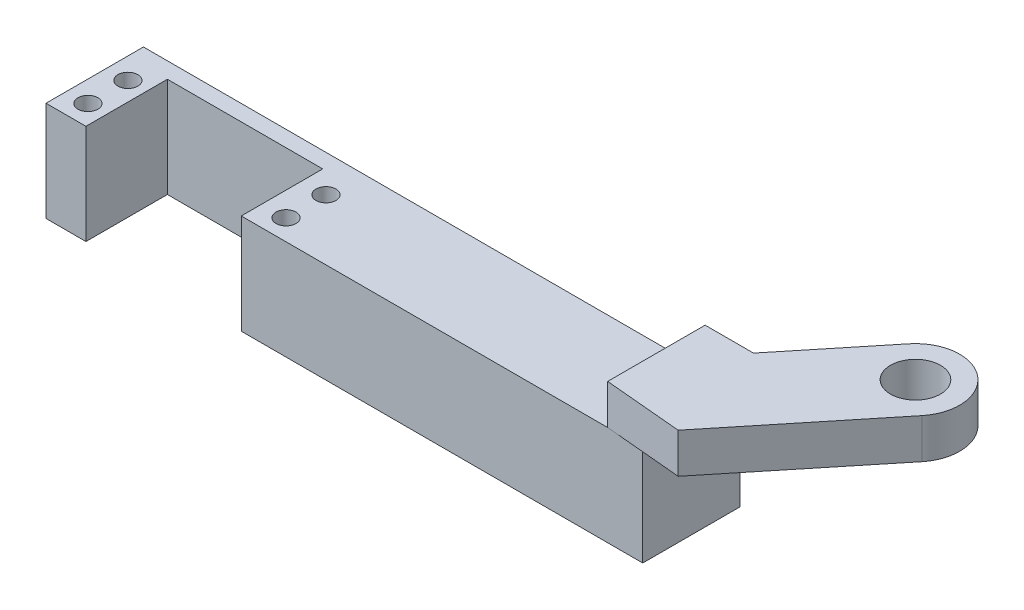
ISO-10303-21;
HEADER;
FILE_DESCRIPTION(('STEP AP214'),'2;1');
FILE_NAME('part.step','',(''),(''),'','','');
FILE_SCHEMA(('AUTOMOTIVE_DESIGN { 1 0 10303 214 1 1 1 1 }'));
ENDSEC;
DATA;
#1=APPLICATION_CONTEXT('core data for automotive mechanical design processes');
#2=APPLICATION_PROTOCOL_DEFINITION('international standard','automotive_design',2000,#1);
#3=PRODUCT_CONTEXT('',#1,'mechanical');
#4=PRODUCT('Part','Part','',(#3));
#5=PRODUCT_RELATED_PRODUCT_CATEGORY('part','',(#4));
#6=PRODUCT_DEFINITION_FORMATION('','',#4);
#7=PRODUCT_DEFINITION_CONTEXT('part definition',#1,'design');
#8=PRODUCT_DEFINITION('design','',#6,#7);
#9=PRODUCT_DEFINITION_SHAPE('','',#8);
#10=(LENGTH_UNIT() NAMED_UNIT(*) SI_UNIT(.MILLI.,.METRE.));
#11=(NAMED_UNIT(*) PLANE_ANGLE_UNIT() SI_UNIT($,.RADIAN.));
#12=(NAMED_UNIT(*) SI_UNIT($,.STERADIAN.) SOLID_ANGLE_UNIT());
#13=UNCERTAINTY_MEASURE_WITH_UNIT(LENGTH_MEASURE(1.E-05),#10,'distance_accuracy_value','');
#14=(GEOMETRIC_REPRESENTATION_CONTEXT(3) GLOBAL_UNCERTAINTY_ASSIGNED_CONTEXT((#13)) GLOBAL_UNIT_ASSIGNED_CONTEXT((#10,
#11,#12)) REPRESENTATION_CONTEXT('',''));
#15=CARTESIAN_POINT('',(0.,0.,0.));
#16=DIRECTION('',(0.,0.,1.));
#17=DIRECTION('',(1.,0.,0.));
#18=AXIS2_PLACEMENT_3D('',#15,#16,#17);
#19=CARTESIAN_POINT('',(0.,25.,0.));
#20=DIRECTION('',(0.,-1.,0.));
#21=DIRECTION('',(0.,0.,-1.));
#22=AXIS2_PLACEMENT_3D('',#19,#20,#21);
#23=PLANE('',#22);
#24=CARTESIAN_POINT('',(-4.7,25.,-15.2));
#25=DIRECTION('',(0.,1.,0.));
#26=DIRECTION('',(0.,0.,1.));
#27=AXIS2_PLACEMENT_3D('',#24,#25,#26);
#28=CIRCLE('',#27,2.5);
#29=CARTESIAN_POINT('',(-4.7,25.,-12.7));
#30=VERTEX_POINT('',#29);
#31=EDGE_CURVE('E201',#30,#30,#28,.T.);
#32=ORIENTED_EDGE('',*,*,#31,.F.);
#33=EDGE_LOOP('',(#32));
#34=FACE_BOUND('',#33,.T.);
#35=CARTESIAN_POINT('',(-4.7,25.,-5.2));
#36=DIRECTION('',(0.,1.,0.));
#37=DIRECTION('',(0.,0.,1.));
#38=AXIS2_PLACEMENT_3D('',#35,#36,#37);
#39=CIRCLE('',#38,2.5);
#40=CARTESIAN_POINT('',(-4.7,25.,-2.7));
#41=VERTEX_POINT('',#40);
#42=EDGE_CURVE('E220',#41,#41,#39,.T.);
#43=ORIENTED_EDGE('',*,*,#42,.F.);
#44=EDGE_LOOP('',(#43));
#45=FACE_BOUND('',#44,.T.);
#46=CARTESIAN_POINT('',(44.9,25.,-5.2));
#47=DIRECTION('',(0.,1.,0.));
#48=DIRECTION('',(0.,0.,-1.));
#49=AXIS2_PLACEMENT_3D('',#46,#47,#48);
#50=CIRCLE('',#49,2.5);
#51=CARTESIAN_POINT('',(44.9,25.,-7.7));
#52=VERTEX_POINT('',#51);
#53=EDGE_CURVE('E214',#52,#52,#50,.T.);
#54=ORIENTED_EDGE('',*,*,#53,.F.);
#55=EDGE_LOOP('',(#54));
#56=FACE_BOUND('',#55,.T.);
#57=CARTESIAN_POINT('',(44.9,25.,-15.2));
#58=DIRECTION('',(0.,1.,0.));
#59=DIRECTION('',(0.,0.,-1.));
#60=AXIS2_PLACEMENT_3D('',#57,#58,#59);
#61=CIRCLE('',#60,2.49999999999999);
#62=CARTESIAN_POINT('',(44.9,25.,-17.7));
#63=VERTEX_POINT('',#62);
#64=EDGE_CURVE('E207',#63,#63,#61,.T.);
#65=ORIENTED_EDGE('',*,*,#64,.F.);
#66=EDGE_LOOP('',(#65));
#67=FACE_BOUND('',#66,.T.);
#68=DIRECTION('',(0.,0.,1.));
#69=VECTOR('',#68,1.);
#70=CARTESIAN_POINT('',(130.655933967255,25.,0.));
#71=LINE('',#70,#69);
#72=CARTESIAN_POINT('',(130.655933967255,25.,-24.4));
#73=VERTEX_POINT('',#72);
#74=CARTESIAN_POINT('',(130.655933967255,25.,0.));
#75=VERTEX_POINT('',#74);
#76=EDGE_CURVE('E48',#73,#75,#71,.T.);
#77=ORIENTED_EDGE('',*,*,#76,.F.);
#78=DIRECTION('',(-1.,0.,0.));
#79=VECTOR('',#78,1.);
#80=CARTESIAN_POINT('',(-10.,25.,-24.4));
#81=LINE('',#80,#79);
#82=CARTESIAN_POINT('',(-10.,25.,-24.4));
#83=VERTEX_POINT('',#82);
#84=EDGE_CURVE('E111',#73,#83,#81,.T.);
#85=ORIENTED_EDGE('',*,*,#84,.T.);
#86=DIRECTION('',(0.,0.,1.));
#87=VECTOR('',#86,1.);
#88=CARTESIAN_POINT('',(-10.,25.,0.));
#89=LINE('',#88,#87);
#90=CARTESIAN_POINT('',(-10.,25.,0.));
#91=VERTEX_POINT('',#90);
#92=EDGE_CURVE('E114',#83,#91,#89,.T.);
#93=ORIENTED_EDGE('',*,*,#92,.T.);
#94=DIRECTION('',(1.,0.,0.));
#95=VECTOR('',#94,1.);
#96=CARTESIAN_POINT('',(0.,25.,0.));
#97=LINE('',#96,#95);
#98=CARTESIAN_POINT('',(0.,25.,0.));
#99=VERTEX_POINT('',#98);
#100=EDGE_CURVE('E56',#91,#99,#97,.T.);
#101=ORIENTED_EDGE('',*,*,#100,.T.);
#102=DIRECTION('',(0.,0.,-1.));
#103=VECTOR('',#102,1.);
#104=CARTESIAN_POINT('',(0.,25.,-20.4));
#105=LINE('',#104,#103);
#106=CARTESIAN_POINT('',(0.,25.,-20.4));
#107=VERTEX_POINT('',#106);
#108=EDGE_CURVE('E154',#99,#107,#105,.T.);
#109=ORIENTED_EDGE('',*,*,#108,.T.);
#110=DIRECTION('',(1.,0.,0.));
#111=VECTOR('',#110,1.);
#112=CARTESIAN_POINT('',(38.897409924959,25.,-20.4));
#113=LINE('',#112,#111);
#114=CARTESIAN_POINT('',(38.897409924959,25.,-20.4));
#115=VERTEX_POINT('',#114);
#116=EDGE_CURVE('E97',#107,#115,#113,.T.);
#117=ORIENTED_EDGE('',*,*,#116,.T.);
#118=DIRECTION('',(0.,0.,1.));
#119=VECTOR('',#118,1.);
#120=CARTESIAN_POINT('',(38.897409924959,25.,0.));
#121=LINE('',#120,#119);
#122=CARTESIAN_POINT('',(38.897409924959,25.,0.));
#123=VERTEX_POINT('',#122);
#124=EDGE_CURVE('E169',#115,#123,#121,.T.);
#125=ORIENTED_EDGE('',*,*,#124,.T.);
#126=DIRECTION('',(1.,0.,0.));
#127=VECTOR('',#126,1.);
#128=CARTESIAN_POINT('',(139.433967886141,25.,0.));
#129=LINE('',#128,#127);
#130=EDGE_CURVE('E187',#123,#75,#129,.T.);
#131=ORIENTED_EDGE('',*,*,#130,.T.);
#132=EDGE_LOOP('',(#77,#85,#93,#101,#109,#117,#125,#131));
#133=FACE_BOUND('',#132,.T.);
#134=ADVANCED_FACE('F33',(#34,#45,#56,#67,#133),#23,.F.);
#135=CARTESIAN_POINT('',(0.,25.,-20.4));
#136=DIRECTION('',(-1.,0.,0.));
#137=DIRECTION('',(0.,0.,1.));
#138=AXIS2_PLACEMENT_3D('',#135,#136,#137);
#139=PLANE('',#138);
#140=DIRECTION('',(0.,0.,-1.));
#141=VECTOR('',#140,1.);
#142=CARTESIAN_POINT('',(0.,0.,-20.4));
#143=LINE('',#142,#141);
#144=CARTESIAN_POINT('',(0.,0.,0.));
#145=VERTEX_POINT('',#144);
#146=CARTESIAN_POINT('',(0.,0.,-20.4));
#147=VERTEX_POINT('',#146);
#148=EDGE_CURVE('E138',#145,#147,#143,.T.);
#149=ORIENTED_EDGE('',*,*,#148,.T.);
#150=DIRECTION('',(0.,-1.,0.));
#151=VECTOR('',#150,1.);
#152=CARTESIAN_POINT('',(0.,25.,-20.4));
#153=LINE('',#152,#151);
#154=EDGE_CURVE('E11',#107,#147,#153,.T.);
#155=ORIENTED_EDGE('',*,*,#154,.F.);
#156=ORIENTED_EDGE('',*,*,#108,.F.);
#157=DIRECTION('',(0.,-1.,0.));
#158=VECTOR('',#157,1.);
#159=CARTESIAN_POINT('',(0.,25.,0.));
#160=LINE('',#159,#158);
#161=EDGE_CURVE('E134',#99,#145,#160,.T.);
#162=ORIENTED_EDGE('',*,*,#161,.T.);
#163=EDGE_LOOP('',(#149,#155,#156,#162));
#164=FACE_BOUND('',#163,.T.);
#165=ADVANCED_FACE('F35',(#164),#139,.F.);
#166=CARTESIAN_POINT('',(38.897409924959,25.,-20.4));
#167=DIRECTION('',(0.,0.,-1.));
#168=DIRECTION('',(-1.,0.,0.));
#169=AXIS2_PLACEMENT_3D('',#166,#167,#168);
#170=PLANE('',#169);
#171=DIRECTION('',(1.,0.,0.));
#172=VECTOR('',#171,1.);
#173=CARTESIAN_POINT('',(38.897409924959,0.,-20.4));
#174=LINE('',#173,#172);
#175=CARTESIAN_POINT('',(38.897409924959,0.,-20.4));
#176=VERTEX_POINT('',#175);
#177=EDGE_CURVE('E141',#147,#176,#174,.T.);
#178=ORIENTED_EDGE('',*,*,#177,.T.);
#179=DIRECTION('',(0.,-1.,0.));
#180=VECTOR('',#179,1.);
#181=CARTESIAN_POINT('',(38.897409924959,25.,-20.4));
#182=LINE('',#181,#180);
#183=EDGE_CURVE('E41',#115,#176,#182,.T.);
#184=ORIENTED_EDGE('',*,*,#183,.F.);
#185=ORIENTED_EDGE('',*,*,#116,.F.);
#186=ORIENTED_EDGE('',*,*,#154,.T.);
#187=EDGE_LOOP('',(#178,#184,#185,#186));
#188=FACE_BOUND('',#187,.T.);
#189=ADVANCED_FACE('F303',(#188),#170,.F.);
#190=CARTESIAN_POINT('',(38.897409924959,25.,0.));
#191=DIRECTION('',(1.,0.,0.));
#192=DIRECTION('',(0.,0.,-1.));
#193=AXIS2_PLACEMENT_3D('',#190,#191,#192);
#194=PLANE('',#193);
#195=DIRECTION('',(0.,0.,1.));
#196=VECTOR('',#195,1.);
#197=CARTESIAN_POINT('',(38.897409924959,0.,0.));
#198=LINE('',#197,#196);
#199=CARTESIAN_POINT('',(38.897409924959,0.,0.));
#200=VERTEX_POINT('',#199);
#201=EDGE_CURVE('E144',#176,#200,#198,.T.);
#202=ORIENTED_EDGE('',*,*,#201,.T.);
#203=DIRECTION('',(0.,-1.,0.));
#204=VECTOR('',#203,1.);
#205=CARTESIAN_POINT('',(38.897409924959,25.,0.));
#206=LINE('',#205,#204);
#207=EDGE_CURVE('E161',#123,#200,#206,.T.);
#208=ORIENTED_EDGE('',*,*,#207,.F.);
#209=ORIENTED_EDGE('',*,*,#124,.F.);
#210=ORIENTED_EDGE('',*,*,#183,.T.);
#211=EDGE_LOOP('',(#202,#208,#209,#210));
#212=FACE_BOUND('',#211,.T.);
#213=ADVANCED_FACE('F167',(#212),#194,.F.);
#214=CARTESIAN_POINT('',(139.433967886141,25.,0.));
#215=DIRECTION('',(0.,0.,-1.));
#216=DIRECTION('',(-1.,0.,0.));
#217=AXIS2_PLACEMENT_3D('',#214,#215,#216);
#218=PLANE('',#217);
#219=DIRECTION('',(1.,0.,0.));
#220=VECTOR('',#219,1.);
#221=CARTESIAN_POINT('',(139.433967886141,0.,0.));
#222=LINE('',#221,#220);
#223=CARTESIAN_POINT('',(139.433967886141,0.,0.));
#224=VERTEX_POINT('',#223);
#225=EDGE_CURVE('E146',#200,#224,#222,.T.);
#226=ORIENTED_EDGE('',*,*,#225,.T.);
#227=DIRECTION('',(0.,-1.,0.));
#228=VECTOR('',#227,1.);
#229=CARTESIAN_POINT('',(139.433967886141,25.,0.));
#230=LINE('',#229,#228);
#231=CARTESIAN_POINT('',(139.433967886141,25.,0.));
#232=VERTEX_POINT('',#231);
#233=EDGE_CURVE('E158',#232,#224,#230,.T.);
#234=ORIENTED_EDGE('',*,*,#233,.F.);
#235=EDGE_CURVE('E189',#75,#232,#129,.T.);
#236=ORIENTED_EDGE('',*,*,#235,.F.);
#237=ORIENTED_EDGE('',*,*,#130,.F.);
#238=ORIENTED_EDGE('',*,*,#207,.T.);
#239=EDGE_LOOP('',(#226,#234,#236,#237,#238));
#240=FACE_BOUND('',#239,.T.);
#241=ADVANCED_FACE('F176',(#240),#218,.F.);
#242=CARTESIAN_POINT('',(139.433967886141,25.,-24.4));
#243=DIRECTION('',(-1.,0.,0.));
#244=DIRECTION('',(0.,0.,1.));
#245=AXIS2_PLACEMENT_3D('',#242,#243,#244);
#246=PLANE('',#245);
#247=DIRECTION('',(0.,0.,-1.));
#248=VECTOR('',#247,1.);
#249=CARTESIAN_POINT('',(139.433967886141,0.,-24.4));
#250=LINE('',#249,#248);
#251=CARTESIAN_POINT('',(139.433967886141,0.,-24.4));
#252=VERTEX_POINT('',#251);
#253=EDGE_CURVE('E148',#224,#252,#250,.T.);
#254=ORIENTED_EDGE('',*,*,#253,.T.);
#255=DIRECTION('',(0.,-1.,0.));
#256=VECTOR('',#255,1.);
#257=CARTESIAN_POINT('',(139.433967886141,25.,-24.4));
#258=LINE('',#257,#256);
#259=CARTESIAN_POINT('',(139.433967886141,25.,-24.4));
#260=VERTEX_POINT('',#259);
#261=EDGE_CURVE('E129',#260,#252,#258,.T.);
#262=ORIENTED_EDGE('',*,*,#261,.F.);
#263=DIRECTION('',(0.,0.,-1.));
#264=VECTOR('',#263,1.);
#265=CARTESIAN_POINT('',(139.433967886141,25.,-24.4));
#266=LINE('',#265,#264);
#267=EDGE_CURVE('E119',#232,#260,#266,.T.);
#268=ORIENTED_EDGE('',*,*,#267,.F.);
#269=ORIENTED_EDGE('',*,*,#233,.T.);
#270=EDGE_LOOP('',(#254,#262,#268,#269));
#271=FACE_BOUND('',#270,.T.);
#272=ADVANCED_FACE('F181',(#271),#246,.F.);
#273=CARTESIAN_POINT('',(-10.,25.,-24.4));
#274=DIRECTION('',(0.,0.,1.));
#275=DIRECTION('',(1.,0.,0.));
#276=AXIS2_PLACEMENT_3D('',#273,#274,#275);
#277=PLANE('',#276);
#278=DIRECTION('',(-1.,0.,0.));
#279=VECTOR('',#278,1.);
#280=CARTESIAN_POINT('',(-10.,0.,-24.4));
#281=LINE('',#280,#279);
#282=CARTESIAN_POINT('',(-10.,0.,-24.4));
#283=VERTEX_POINT('',#282);
#284=EDGE_CURVE('E126',#252,#283,#281,.T.);
#285=ORIENTED_EDGE('',*,*,#284,.T.);
#286=DIRECTION('',(0.,-1.,0.));
#287=VECTOR('',#286,1.);
#288=CARTESIAN_POINT('',(-10.,25.,-24.4));
#289=LINE('',#288,#287);
#290=EDGE_CURVE('E122',#83,#283,#289,.T.);
#291=ORIENTED_EDGE('',*,*,#290,.F.);
#292=ORIENTED_EDGE('',*,*,#84,.F.);
#293=DIRECTION('',(0.,-1.,0.));
#294=VECTOR('',#293,1.);
#295=CARTESIAN_POINT('',(130.655933967255,35.,-24.4));
#296=LINE('',#295,#294);
#297=CARTESIAN_POINT('',(130.655933967255,35.,-24.4));
#298=VERTEX_POINT('',#297);
#299=EDGE_CURVE('E238',#298,#73,#296,.T.);
#300=ORIENTED_EDGE('',*,*,#299,.F.);
#301=DIRECTION('',(-1.,0.,0.));
#302=VECTOR('',#301,1.);
#303=CARTESIAN_POINT('',(130.655933967255,35.,-24.4));
#304=LINE('',#303,#302);
#305=CARTESIAN_POINT('',(142.775772415348,35.,-24.4));
#306=VERTEX_POINT('',#305);
#307=EDGE_CURVE('E240',#306,#298,#304,.T.);
#308=ORIENTED_EDGE('',*,*,#307,.F.);
#309=DIRECTION('',(0.,-1.,0.));
#310=VECTOR('',#309,1.);
#311=CARTESIAN_POINT('',(142.775772415348,35.,-24.4));
#312=LINE('',#311,#310);
#313=CARTESIAN_POINT('',(142.775772415348,25.,-24.4));
#314=VERTEX_POINT('',#313);
#315=EDGE_CURVE('E235',#306,#314,#312,.T.);
#316=ORIENTED_EDGE('',*,*,#315,.T.);
#317=DIRECTION('',(-1.,0.,0.));
#318=VECTOR('',#317,1.);
#319=CARTESIAN_POINT('',(130.655933967255,25.,-24.4));
#320=LINE('',#319,#318);
#321=EDGE_CURVE('E241',#314,#260,#320,.T.);
#322=ORIENTED_EDGE('',*,*,#321,.T.);
#323=ORIENTED_EDGE('',*,*,#261,.T.);
#324=EDGE_LOOP('',(#285,#291,#292,#300,#308,#316,#322,#323));
#325=FACE_BOUND('',#324,.T.);
#326=ADVANCED_FACE('F123',(#325),#277,.F.);
#327=CARTESIAN_POINT('',(-10.,25.,0.));
#328=DIRECTION('',(1.,0.,0.));
#329=DIRECTION('',(0.,0.,-1.));
#330=AXIS2_PLACEMENT_3D('',#327,#328,#329);
#331=PLANE('',#330);
#332=DIRECTION('',(0.,0.,1.));
#333=VECTOR('',#332,1.);
#334=CARTESIAN_POINT('',(-10.,0.,0.));
#335=LINE('',#334,#333);
#336=CARTESIAN_POINT('',(-10.,0.,0.));
#337=VERTEX_POINT('',#336);
#338=EDGE_CURVE('E151',#283,#337,#335,.T.);
#339=ORIENTED_EDGE('',*,*,#338,.T.);
#340=DIRECTION('',(0.,-1.,0.));
#341=VECTOR('',#340,1.);
#342=CARTESIAN_POINT('',(-10.,25.,0.));
#343=LINE('',#342,#341);
#344=EDGE_CURVE('E130',#91,#337,#343,.T.);
#345=ORIENTED_EDGE('',*,*,#344,.F.);
#346=ORIENTED_EDGE('',*,*,#92,.F.);
#347=ORIENTED_EDGE('',*,*,#290,.T.);
#348=EDGE_LOOP('',(#339,#345,#346,#347));
#349=FACE_BOUND('',#348,.T.);
#350=ADVANCED_FACE('F132',(#349),#331,.F.);
#351=CARTESIAN_POINT('',(0.,25.,0.));
#352=DIRECTION('',(0.,0.,-1.));
#353=DIRECTION('',(-1.,0.,0.));
#354=AXIS2_PLACEMENT_3D('',#351,#352,#353);
#355=PLANE('',#354);
#356=DIRECTION('',(1.,0.,0.));
#357=VECTOR('',#356,1.);
#358=CARTESIAN_POINT('',(0.,0.,0.));
#359=LINE('',#358,#357);
#360=EDGE_CURVE('E89',#337,#145,#359,.T.);
#361=ORIENTED_EDGE('',*,*,#360,.T.);
#362=ORIENTED_EDGE('',*,*,#161,.F.);
#363=ORIENTED_EDGE('',*,*,#100,.F.);
#364=ORIENTED_EDGE('',*,*,#344,.T.);
#365=EDGE_LOOP('',(#361,#362,#363,#364));
#366=FACE_BOUND('',#365,.T.);
#367=ADVANCED_FACE('F313',(#366),#355,.F.);
#368=CARTESIAN_POINT('',(0.,0.,0.));
#369=DIRECTION('',(0.,-1.,0.));
#370=DIRECTION('',(0.,0.,-1.));
#371=AXIS2_PLACEMENT_3D('',#368,#369,#370);
#372=PLANE('',#371);
#373=ORIENTED_EDGE('',*,*,#148,.F.);
#374=ORIENTED_EDGE('',*,*,#360,.F.);
#375=ORIENTED_EDGE('',*,*,#338,.F.);
#376=ORIENTED_EDGE('',*,*,#284,.F.);
#377=ORIENTED_EDGE('',*,*,#253,.F.);
#378=ORIENTED_EDGE('',*,*,#225,.F.);
#379=ORIENTED_EDGE('',*,*,#201,.F.);
#380=ORIENTED_EDGE('',*,*,#177,.F.);
#381=EDGE_LOOP('',(#373,#374,#375,#376,#377,#378,#379,#380));
#382=FACE_BOUND('',#381,.T.);
#383=ADVANCED_FACE('F173',(#382),#372,.T.);
#384=CARTESIAN_POINT('',(-4.7,15.,-15.2));
#385=DIRECTION('',(0.,1.,0.));
#386=DIRECTION('',(0.,0.,1.));
#387=AXIS2_PLACEMENT_3D('',#384,#385,#386);
#388=CYLINDRICAL_SURFACE('',#387,2.5);
#389=CARTESIAN_POINT('',(-4.7,15.,-15.2));
#390=DIRECTION('',(0.,1.,0.));
#391=DIRECTION('',(0.,0.,1.));
#392=AXIS2_PLACEMENT_3D('',#389,#390,#391);
#393=CIRCLE('',#392,2.5);
#394=CARTESIAN_POINT('',(-4.7,15.,-12.7));
#395=VERTEX_POINT('',#394);
#396=EDGE_CURVE('E142',#395,#395,#393,.T.);
#397=ORIENTED_EDGE('',*,*,#396,.F.);
#398=EDGE_LOOP('',(#397));
#399=FACE_BOUND('',#398,.T.);
#400=ORIENTED_EDGE('',*,*,#31,.T.);
#401=EDGE_LOOP('',(#400));
#402=FACE_BOUND('',#401,.T.);
#403=ADVANCED_FACE('F309',(#399,#402),#388,.F.);
#404=CARTESIAN_POINT('',(-4.7,15.,-15.2));
#405=DIRECTION('',(0.,1.,0.));
#406=DIRECTION('',(0.,0.,1.));
#407=AXIS2_PLACEMENT_3D('',#404,#405,#406);
#408=PLANE('',#407);
#409=ORIENTED_EDGE('',*,*,#396,.T.);
#410=EDGE_LOOP('',(#409));
#411=FACE_BOUND('',#410,.T.);
#412=ADVANCED_FACE('F386',(#411),#408,.T.);
#413=CARTESIAN_POINT('',(-4.7,15.,-5.2));
#414=DIRECTION('',(0.,1.,0.));
#415=DIRECTION('',(0.,0.,1.));
#416=AXIS2_PLACEMENT_3D('',#413,#414,#415);
#417=CYLINDRICAL_SURFACE('',#416,2.5);
#418=CARTESIAN_POINT('',(-4.7,15.,-5.2));
#419=DIRECTION('',(0.,1.,0.));
#420=DIRECTION('',(0.,0.,1.));
#421=AXIS2_PLACEMENT_3D('',#418,#419,#420);
#422=CIRCLE('',#421,2.5);
#423=CARTESIAN_POINT('',(-4.7,15.,-2.7));
#424=VERTEX_POINT('',#423);
#425=EDGE_CURVE('E204',#424,#424,#422,.T.);
#426=ORIENTED_EDGE('',*,*,#425,.F.);
#427=EDGE_LOOP('',(#426));
#428=FACE_BOUND('',#427,.T.);
#429=ORIENTED_EDGE('',*,*,#42,.T.);
#430=EDGE_LOOP('',(#429));
#431=FACE_BOUND('',#430,.T.);
#432=ADVANCED_FACE('F382',(#428,#431),#417,.F.);
#433=CARTESIAN_POINT('',(-4.7,15.,-5.2));
#434=DIRECTION('',(0.,1.,0.));
#435=DIRECTION('',(0.,0.,1.));
#436=AXIS2_PLACEMENT_3D('',#433,#434,#435);
#437=PLANE('',#436);
#438=ORIENTED_EDGE('',*,*,#425,.T.);
#439=EDGE_LOOP('',(#438));
#440=FACE_BOUND('',#439,.T.);
#441=ADVANCED_FACE('F378',(#440),#437,.T.);
#442=CARTESIAN_POINT('',(44.9,15.,-5.2));
#443=DIRECTION('',(0.,1.,0.));
#444=DIRECTION('',(0.,0.,1.));
#445=AXIS2_PLACEMENT_3D('',#442,#443,#444);
#446=CYLINDRICAL_SURFACE('',#445,2.5);
#447=CARTESIAN_POINT('',(44.9,15.,-5.2));
#448=DIRECTION('',(0.,1.,0.));
#449=DIRECTION('',(0.,0.,-1.));
#450=AXIS2_PLACEMENT_3D('',#447,#448,#449);
#451=CIRCLE('',#450,2.5);
#452=CARTESIAN_POINT('',(44.9,15.,-7.7));
#453=VERTEX_POINT('',#452);
#454=EDGE_CURVE('E217',#453,#453,#451,.T.);
#455=ORIENTED_EDGE('',*,*,#454,.F.);
#456=EDGE_LOOP('',(#455));
#457=FACE_BOUND('',#456,.T.);
#458=ORIENTED_EDGE('',*,*,#53,.T.);
#459=EDGE_LOOP('',(#458));
#460=FACE_BOUND('',#459,.T.);
#461=ADVANCED_FACE('F381',(#457,#460),#446,.F.);
#462=CARTESIAN_POINT('',(44.9,15.,-5.2));
#463=DIRECTION('',(0.,-1.,0.));
#464=DIRECTION('',(0.,0.,-1.));
#465=AXIS2_PLACEMENT_3D('',#462,#463,#464);
#466=PLANE('',#465);
#467=ORIENTED_EDGE('',*,*,#454,.T.);
#468=EDGE_LOOP('',(#467));
#469=FACE_BOUND('',#468,.T.);
#470=ADVANCED_FACE('F388',(#469),#466,.F.);
#471=CARTESIAN_POINT('',(44.9,15.,-15.2));
#472=DIRECTION('',(0.,1.,0.));
#473=DIRECTION('',(0.,0.,1.));
#474=AXIS2_PLACEMENT_3D('',#471,#472,#473);
#475=CYLINDRICAL_SURFACE('',#474,2.49999999999999);
#476=CARTESIAN_POINT('',(44.9,15.,-15.2));
#477=DIRECTION('',(0.,1.,0.));
#478=DIRECTION('',(0.,0.,-1.));
#479=AXIS2_PLACEMENT_3D('',#476,#477,#478);
#480=CIRCLE('',#479,2.49999999999999);
#481=CARTESIAN_POINT('',(44.9,15.,-17.7));
#482=VERTEX_POINT('',#481);
#483=EDGE_CURVE('E210',#482,#482,#480,.T.);
#484=ORIENTED_EDGE('',*,*,#483,.F.);
#485=EDGE_LOOP('',(#484));
#486=FACE_BOUND('',#485,.T.);
#487=ORIENTED_EDGE('',*,*,#64,.T.);
#488=EDGE_LOOP('',(#487));
#489=FACE_BOUND('',#488,.T.);
#490=ADVANCED_FACE('F391',(#486,#489),#475,.F.);
#491=CARTESIAN_POINT('',(44.9,15.,-15.2));
#492=DIRECTION('',(0.,-1.,0.));
#493=DIRECTION('',(0.,0.,-1.));
#494=AXIS2_PLACEMENT_3D('',#491,#492,#493);
#495=PLANE('',#494);
#496=ORIENTED_EDGE('',*,*,#483,.T.);
#497=EDGE_LOOP('',(#496));
#498=FACE_BOUND('',#497,.T.);
#499=ADVANCED_FACE('F293',(#498),#495,.F.);
#500=CARTESIAN_POINT('',(168.821048861303,25.,-38.9079407271337));
#501=DIRECTION('',(0.,1.,0.));
#502=DIRECTION('',(0.,0.,1.));
#503=AXIS2_PLACEMENT_3D('',#500,#501,#502);
#504=PLANE('',#503);
#505=CARTESIAN_POINT('',(168.821048861303,25.,-38.9079407271337));
#506=DIRECTION('',(0.,1.,0.));
#507=DIRECTION('',(0.,0.,1.));
#508=AXIS2_PLACEMENT_3D('',#505,#506,#507);
#509=CIRCLE('',#508,6.26087531094644);
#510=CARTESIAN_POINT('',(168.821048861303,25.,-32.6470654161872));
#511=VERTEX_POINT('',#510);
#512=EDGE_CURVE('E272',#511,#511,#509,.T.);
#513=ORIENTED_EDGE('',*,*,#512,.T.);
#514=EDGE_LOOP('',(#513));
#515=FACE_BOUND('',#514,.T.);
#516=DIRECTION('',(0.995925965929565,0.,0.0901746659947437));
#517=VECTOR('',#516,1.);
#518=CARTESIAN_POINT('',(150.060915273689,25.,1.75699576856475));
#519=LINE('',#518,#517);
#520=CARTESIAN_POINT('',(150.060915273689,25.,1.75699576856475));
#521=VERTEX_POINT('',#520);
#522=EDGE_CURVE('E194',#75,#521,#519,.T.);
#523=ORIENTED_EDGE('',*,*,#522,.F.);
#524=ORIENTED_EDGE('',*,*,#235,.T.);
#525=ORIENTED_EDGE('',*,*,#267,.T.);
#526=ORIENTED_EDGE('',*,*,#321,.F.);
#527=DIRECTION('',(-0.630401472595071,0.,0.776269272449944));
#528=VECTOR('',#527,1.);
#529=CARTESIAN_POINT('',(142.775772415348,25.,-24.4));
#530=LINE('',#529,#528);
#531=CARTESIAN_POINT('',(160.225946605777,25.,-45.887947937632));
#532=VERTEX_POINT('',#531);
#533=EDGE_CURVE('E244',#532,#314,#530,.T.);
#534=ORIENTED_EDGE('',*,*,#533,.F.);
#535=CARTESIAN_POINT('',(168.821048861303,25.,-38.9079407271337));
#536=DIRECTION('',(0.,1.,0.));
#537=DIRECTION('',(0.,0.,1.));
#538=AXIS2_PLACEMENT_3D('',#535,#536,#537);
#539=CIRCLE('',#538,11.0723205987524);
#540=CARTESIAN_POINT('',(177.41615111683,25.,-31.9279335166354));
#541=VERTEX_POINT('',#540);
#542=EDGE_CURVE('E247',#541,#532,#539,.T.);
#543=ORIENTED_EDGE('',*,*,#542,.F.);
#544=DIRECTION('',(0.630401472595071,0.,-0.776269272449944));
#545=VECTOR('',#544,1.);
#546=CARTESIAN_POINT('',(177.41615111683,25.,-31.9279335166354));
#547=LINE('',#546,#545);
#548=EDGE_CURVE('E250',#521,#541,#547,.T.);
#549=ORIENTED_EDGE('',*,*,#548,.F.);
#550=EDGE_LOOP('',(#523,#524,#525,#526,#534,#543,#549));
#551=FACE_BOUND('',#550,.T.);
#552=ADVANCED_FACE('F190',(#515,#551),#504,.F.);
#553=CARTESIAN_POINT('',(168.821048861303,35.,-38.9079407271337));
#554=DIRECTION('',(0.,1.,0.));
#555=DIRECTION('',(0.,0.,1.));
#556=AXIS2_PLACEMENT_3D('',#553,#554,#555);
#557=PLANE('',#556);
#558=DIRECTION('',(0.,0.,1.));
#559=VECTOR('',#558,1.);
#560=CARTESIAN_POINT('',(130.655933967255,35.,0.));
#561=LINE('',#560,#559);
#562=CARTESIAN_POINT('',(130.655933967255,35.,0.));
#563=VERTEX_POINT('',#562);
#564=EDGE_CURVE('E243',#298,#563,#561,.T.);
#565=ORIENTED_EDGE('',*,*,#564,.T.);
#566=DIRECTION('',(0.995925965929565,0.,0.0901746659947437));
#567=VECTOR('',#566,1.);
#568=CARTESIAN_POINT('',(150.060915273689,35.,1.75699576856475));
#569=LINE('',#568,#567);
#570=CARTESIAN_POINT('',(150.060915273689,35.,1.75699576856475));
#571=VERTEX_POINT('',#570);
#572=EDGE_CURVE('E267',#563,#571,#569,.T.);
#573=ORIENTED_EDGE('',*,*,#572,.T.);
#574=DIRECTION('',(0.630401472595071,0.,-0.776269272449944));
#575=VECTOR('',#574,1.);
#576=CARTESIAN_POINT('',(177.41615111683,35.,-31.9279335166354));
#577=LINE('',#576,#575);
#578=CARTESIAN_POINT('',(177.41615111683,35.,-31.9279335166354));
#579=VERTEX_POINT('',#578);
#580=EDGE_CURVE('E264',#571,#579,#577,.T.);
#581=ORIENTED_EDGE('',*,*,#580,.T.);
#582=CARTESIAN_POINT('',(168.821048861303,35.,-38.9079407271337));
#583=DIRECTION('',(0.,1.,0.));
#584=DIRECTION('',(0.,0.,1.));
#585=AXIS2_PLACEMENT_3D('',#582,#583,#584);
#586=CIRCLE('',#585,11.0723205987524);
#587=CARTESIAN_POINT('',(160.225946605777,35.,-45.887947937632));
#588=VERTEX_POINT('',#587);
#589=EDGE_CURVE('E261',#579,#588,#586,.T.);
#590=ORIENTED_EDGE('',*,*,#589,.T.);
#591=DIRECTION('',(-0.630401472595071,0.,0.776269272449944));
#592=VECTOR('',#591,1.);
#593=CARTESIAN_POINT('',(142.775772415348,35.,-24.4));
#594=LINE('',#593,#592);
#595=EDGE_CURVE('E258',#588,#306,#594,.T.);
#596=ORIENTED_EDGE('',*,*,#595,.T.);
#597=ORIENTED_EDGE('',*,*,#307,.T.);
#598=EDGE_LOOP('',(#565,#573,#581,#590,#596,#597));
#599=FACE_BOUND('',#598,.T.);
#600=CARTESIAN_POINT('',(168.821048861303,35.,-38.9079407271337));
#601=DIRECTION('',(0.,1.,0.));
#602=DIRECTION('',(0.,0.,1.));
#603=AXIS2_PLACEMENT_3D('',#600,#601,#602);
#604=CIRCLE('',#603,6.26087531094644);
#605=CARTESIAN_POINT('',(168.821048861303,35.,-32.6470654161872));
#606=VERTEX_POINT('',#605);
#607=EDGE_CURVE('E255',#606,#606,#604,.T.);
#608=ORIENTED_EDGE('',*,*,#607,.F.);
#609=EDGE_LOOP('',(#608));
#610=FACE_BOUND('',#609,.T.);
#611=ADVANCED_FACE('F281',(#599,#610),#557,.T.);
#612=CARTESIAN_POINT('',(130.655933967255,35.,0.));
#613=DIRECTION('',(1.,0.,0.));
#614=DIRECTION('',(0.,0.,-1.));
#615=AXIS2_PLACEMENT_3D('',#612,#613,#614);
#616=PLANE('',#615);
#617=ORIENTED_EDGE('',*,*,#76,.T.);
#618=DIRECTION('',(0.,-1.,0.));
#619=VECTOR('',#618,1.);
#620=CARTESIAN_POINT('',(130.655933967255,35.,0.));
#621=LINE('',#620,#619);
#622=EDGE_CURVE('E211',#563,#75,#621,.T.);
#623=ORIENTED_EDGE('',*,*,#622,.F.);
#624=ORIENTED_EDGE('',*,*,#564,.F.);
#625=ORIENTED_EDGE('',*,*,#299,.T.);
#626=EDGE_LOOP('',(#617,#623,#624,#625));
#627=FACE_BOUND('',#626,.T.);
#628=ADVANCED_FACE('F283',(#627),#616,.F.);
#629=CARTESIAN_POINT('',(150.060915273689,35.,1.75699576856475));
#630=DIRECTION('',(0.0901746659947437,0.,-0.995925965929565));
#631=DIRECTION('',(-0.995925965929565,0.,-0.0901746659947437));
#632=AXIS2_PLACEMENT_3D('',#629,#630,#631);
#633=PLANE('',#632);
#634=ORIENTED_EDGE('',*,*,#522,.T.);
#635=DIRECTION('',(0.,-1.,0.));
#636=VECTOR('',#635,1.);
#637=CARTESIAN_POINT('',(150.060915273689,35.,1.75699576856475));
#638=LINE('',#637,#636);
#639=EDGE_CURVE('E226',#571,#521,#638,.T.);
#640=ORIENTED_EDGE('',*,*,#639,.F.);
#641=ORIENTED_EDGE('',*,*,#572,.F.);
#642=ORIENTED_EDGE('',*,*,#622,.T.);
#643=EDGE_LOOP('',(#634,#640,#641,#642));
#644=FACE_BOUND('',#643,.T.);
#645=ADVANCED_FACE('F290',(#644),#633,.F.);
#646=CARTESIAN_POINT('',(177.41615111683,35.,-31.9279335166354));
#647=DIRECTION('',(-0.776269272449944,0.,-0.630401472595071));
#648=DIRECTION('',(-0.630401472595071,0.,0.776269272449944));
#649=AXIS2_PLACEMENT_3D('',#646,#647,#648);
#650=PLANE('',#649);
#651=ORIENTED_EDGE('',*,*,#548,.T.);
#652=DIRECTION('',(0.,-1.,0.));
#653=VECTOR('',#652,1.);
#654=CARTESIAN_POINT('',(177.41615111683,35.,-31.9279335166354));
#655=LINE('',#654,#653);
#656=EDGE_CURVE('E229',#579,#541,#655,.T.);
#657=ORIENTED_EDGE('',*,*,#656,.F.);
#658=ORIENTED_EDGE('',*,*,#580,.F.);
#659=ORIENTED_EDGE('',*,*,#639,.T.);
#660=EDGE_LOOP('',(#651,#657,#658,#659));
#661=FACE_BOUND('',#660,.T.);
#662=ADVANCED_FACE('F362',(#661),#650,.F.);
#663=CARTESIAN_POINT('',(168.821048861303,35.,-38.9079407271337));
#664=DIRECTION('',(0.,-1.,0.));
#665=DIRECTION('',(0.,0.,-1.));
#666=AXIS2_PLACEMENT_3D('',#663,#664,#665);
#667=CYLINDRICAL_SURFACE('',#666,11.0723205987524);
#668=ORIENTED_EDGE('',*,*,#542,.T.);
#669=DIRECTION('',(0.,-1.,0.));
#670=VECTOR('',#669,1.);
#671=CARTESIAN_POINT('',(160.225946605777,35.,-45.887947937632));
#672=LINE('',#671,#670);
#673=EDGE_CURVE('E232',#588,#532,#672,.T.);
#674=ORIENTED_EDGE('',*,*,#673,.F.);
#675=ORIENTED_EDGE('',*,*,#589,.F.);
#676=ORIENTED_EDGE('',*,*,#656,.T.);
#677=EDGE_LOOP('',(#668,#674,#675,#676));
#678=FACE_BOUND('',#677,.T.);
#679=ADVANCED_FACE('F366',(#678),#667,.T.);
#680=CARTESIAN_POINT('',(142.775772415348,35.,-24.4));
#681=DIRECTION('',(0.776269272449944,0.,0.630401472595071));
#682=DIRECTION('',(0.630401472595071,0.,-0.776269272449944));
#683=AXIS2_PLACEMENT_3D('',#680,#681,#682);
#684=PLANE('',#683);
#685=ORIENTED_EDGE('',*,*,#533,.T.);
#686=ORIENTED_EDGE('',*,*,#315,.F.);
#687=ORIENTED_EDGE('',*,*,#595,.F.);
#688=ORIENTED_EDGE('',*,*,#673,.T.);
#689=EDGE_LOOP('',(#685,#686,#687,#688));
#690=FACE_BOUND('',#689,.T.);
#691=ADVANCED_FACE('F364',(#690),#684,.F.);
#692=CARTESIAN_POINT('',(168.821048861303,35.,-38.9079407271337));
#693=DIRECTION('',(0.,-1.,0.));
#694=DIRECTION('',(0.,0.,-1.));
#695=AXIS2_PLACEMENT_3D('',#692,#693,#694);
#696=CYLINDRICAL_SURFACE('',#695,6.26087531094644);
#697=ORIENTED_EDGE('',*,*,#607,.T.);
#698=EDGE_LOOP('',(#697));
#699=FACE_BOUND('',#698,.T.);
#700=ORIENTED_EDGE('',*,*,#512,.F.);
#701=EDGE_LOOP('',(#700));
#702=FACE_BOUND('',#701,.T.);
#703=ADVANCED_FACE('F278',(#699,#702),#696,.F.);
#704=CLOSED_SHELL('',(#134,#165,#189,#213,#241,#272,#326,#350,#367,#383,#403,#412,#432,#441,
#461,#470,#490,#499,#552,#611,#628,#645,#662,#679,#691,#703));
#705=MANIFOLD_SOLID_BREP('B2',#704);
#706=ADVANCED_BREP_SHAPE_REPRESENTATION('',(#18,#705),#14);
#707=SHAPE_DEFINITION_REPRESENTATION(#9,#706);
ENDSEC;
END-ISO-10303-21;
